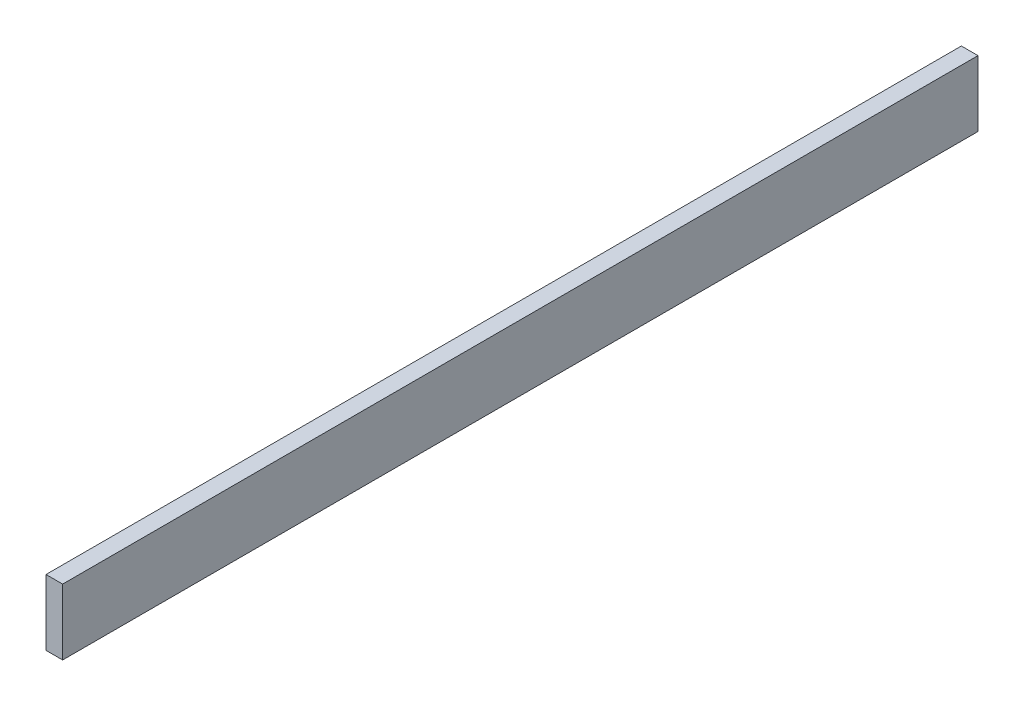
ISO-10303-21;
HEADER;
FILE_DESCRIPTION(('STEP AP214'),'2;1');
FILE_NAME('part.step','',(''),(''),'','','');
FILE_SCHEMA(('AUTOMOTIVE_DESIGN { 1 0 10303 214 1 1 1 1 }'));
ENDSEC;
DATA;
#1=APPLICATION_CONTEXT('core data for automotive mechanical design processes');
#2=APPLICATION_PROTOCOL_DEFINITION('international standard','automotive_design',2000,#1);
#3=PRODUCT_CONTEXT('',#1,'mechanical');
#4=PRODUCT('Part','Part','',(#3));
#5=PRODUCT_RELATED_PRODUCT_CATEGORY('part','',(#4));
#6=PRODUCT_DEFINITION_FORMATION('','',#4);
#7=PRODUCT_DEFINITION_CONTEXT('part definition',#1,'design');
#8=PRODUCT_DEFINITION('design','',#6,#7);
#9=PRODUCT_DEFINITION_SHAPE('','',#8);
#10=(LENGTH_UNIT() NAMED_UNIT(*) SI_UNIT(.MILLI.,.METRE.));
#11=(NAMED_UNIT(*) PLANE_ANGLE_UNIT() SI_UNIT($,.RADIAN.));
#12=(NAMED_UNIT(*) SI_UNIT($,.STERADIAN.) SOLID_ANGLE_UNIT());
#13=UNCERTAINTY_MEASURE_WITH_UNIT(LENGTH_MEASURE(1.E-05),#10,'distance_accuracy_value','');
#14=(GEOMETRIC_REPRESENTATION_CONTEXT(3) GLOBAL_UNCERTAINTY_ASSIGNED_CONTEXT((#13)) GLOBAL_UNIT_ASSIGNED_CONTEXT((#10,
#11,#12)) REPRESENTATION_CONTEXT('',''));
#15=CARTESIAN_POINT('',(0.,0.,0.));
#16=DIRECTION('',(0.,0.,1.));
#17=DIRECTION('',(1.,0.,0.));
#18=AXIS2_PLACEMENT_3D('',#15,#16,#17);
#19=CARTESIAN_POINT('',(-6.35,-22.606,558.8));
#20=DIRECTION('',(1.,0.,0.));
#21=DIRECTION('',(0.,0.,-1.));
#22=AXIS2_PLACEMENT_3D('',#19,#20,#21);
#23=PLANE('',#22);
#24=DIRECTION('',(0.,0.,1.));
#25=VECTOR('',#24,1.);
#26=CARTESIAN_POINT('',(-6.35,20.066,0.));
#27=LINE('',#26,#25);
#28=CARTESIAN_POINT('',(-6.35,20.066,0.));
#29=VERTEX_POINT('',#28);
#30=CARTESIAN_POINT('',(-6.35,20.066,558.8));
#31=VERTEX_POINT('',#30);
#32=EDGE_CURVE('E85',#29,#31,#27,.T.);
#33=ORIENTED_EDGE('',*,*,#32,.F.);
#34=DIRECTION('',(0.,-1.,0.));
#35=VECTOR('',#34,1.);
#36=CARTESIAN_POINT('',(-6.35,-22.606,0.));
#37=LINE('',#36,#35);
#38=CARTESIAN_POINT('',(-6.35,-20.066,0.));
#39=VERTEX_POINT('',#38);
#40=EDGE_CURVE('E40',#29,#39,#37,.T.);
#41=ORIENTED_EDGE('',*,*,#40,.T.);
#42=DIRECTION('',(0.,0.,1.));
#43=VECTOR('',#42,1.);
#44=CARTESIAN_POINT('',(-6.35,-20.066,0.));
#45=LINE('',#44,#43);
#46=CARTESIAN_POINT('',(-6.35,-20.066,558.8));
#47=VERTEX_POINT('',#46);
#48=EDGE_CURVE('E51',#39,#47,#45,.T.);
#49=ORIENTED_EDGE('',*,*,#48,.T.);
#50=DIRECTION('',(0.,-1.,0.));
#51=VECTOR('',#50,1.);
#52=CARTESIAN_POINT('',(-6.35,-22.606,558.8));
#53=LINE('',#52,#51);
#54=EDGE_CURVE('E12',#31,#47,#53,.T.);
#55=ORIENTED_EDGE('',*,*,#54,.F.);
#56=EDGE_LOOP('',(#33,#41,#49,#55));
#57=FACE_BOUND('',#56,.T.);
#58=ADVANCED_FACE('F37',(#57),#23,.F.);
#59=CARTESIAN_POINT('',(0.,0.,558.8));
#60=DIRECTION('',(0.,0.,-1.));
#61=DIRECTION('',(-1.,0.,0.));
#62=AXIS2_PLACEMENT_3D('',#59,#60,#61);
#63=PLANE('',#62);
#64=DIRECTION('',(-1.,0.,0.));
#65=VECTOR('',#64,1.);
#66=CARTESIAN_POINT('',(-6.35,20.066,558.8));
#67=LINE('',#66,#65);
#68=CARTESIAN_POINT('',(3.81,20.066,558.8));
#69=VERTEX_POINT('',#68);
#70=EDGE_CURVE('E83',#69,#31,#67,.T.);
#71=ORIENTED_EDGE('',*,*,#70,.T.);
#72=ORIENTED_EDGE('',*,*,#54,.T.);
#73=DIRECTION('',(1.,0.,0.));
#74=VECTOR('',#73,1.);
#75=CARTESIAN_POINT('',(-6.35,-20.066,558.8));
#76=LINE('',#75,#74);
#77=CARTESIAN_POINT('',(3.81,-20.066,558.8));
#78=VERTEX_POINT('',#77);
#79=EDGE_CURVE('E100',#47,#78,#76,.T.);
#80=ORIENTED_EDGE('',*,*,#79,.T.);
#81=DIRECTION('',(0.,1.,0.));
#82=VECTOR('',#81,1.);
#83=CARTESIAN_POINT('',(3.81,20.066,558.8));
#84=LINE('',#83,#82);
#85=EDGE_CURVE('E103',#78,#69,#84,.T.);
#86=ORIENTED_EDGE('',*,*,#85,.T.);
#87=EDGE_LOOP('',(#71,#72,#80,#86));
#88=FACE_BOUND('',#87,.T.);
#89=ADVANCED_FACE('F109',(#88),#63,.F.);
#90=CARTESIAN_POINT('',(0.,0.,0.));
#91=DIRECTION('',(0.,0.,-1.));
#92=DIRECTION('',(-1.,0.,0.));
#93=AXIS2_PLACEMENT_3D('',#90,#91,#92);
#94=PLANE('',#93);
#95=ORIENTED_EDGE('',*,*,#40,.F.);
#96=DIRECTION('',(-1.,0.,0.));
#97=VECTOR('',#96,1.);
#98=CARTESIAN_POINT('',(-6.35,20.066,0.));
#99=LINE('',#98,#97);
#100=CARTESIAN_POINT('',(3.81,20.066,0.));
#101=VERTEX_POINT('',#100);
#102=EDGE_CURVE('E80',#101,#29,#99,.T.);
#103=ORIENTED_EDGE('',*,*,#102,.F.);
#104=DIRECTION('',(0.,1.,0.));
#105=VECTOR('',#104,1.);
#106=CARTESIAN_POINT('',(3.81,20.066,0.));
#107=LINE('',#106,#105);
#108=CARTESIAN_POINT('',(3.81,-20.066,0.));
#109=VERTEX_POINT('',#108);
#110=EDGE_CURVE('E88',#109,#101,#107,.T.);
#111=ORIENTED_EDGE('',*,*,#110,.F.);
#112=DIRECTION('',(1.,0.,0.));
#113=VECTOR('',#112,1.);
#114=CARTESIAN_POINT('',(-6.35,-20.066,0.));
#115=LINE('',#114,#113);
#116=EDGE_CURVE('E91',#39,#109,#115,.T.);
#117=ORIENTED_EDGE('',*,*,#116,.F.);
#118=EDGE_LOOP('',(#95,#103,#111,#117));
#119=FACE_BOUND('',#118,.T.);
#120=ADVANCED_FACE('F94',(#119),#94,.T.);
#121=CARTESIAN_POINT('',(-6.35,20.066,0.));
#122=DIRECTION('',(0.,1.,0.));
#123=DIRECTION('',(0.,0.,1.));
#124=AXIS2_PLACEMENT_3D('',#121,#122,#123);
#125=PLANE('',#124);
#126=ORIENTED_EDGE('',*,*,#70,.F.);
#127=DIRECTION('',(0.,0.,1.));
#128=VECTOR('',#127,1.);
#129=CARTESIAN_POINT('',(3.81,20.066,0.));
#130=LINE('',#129,#128);
#131=EDGE_CURVE('E77',#101,#69,#130,.T.);
#132=ORIENTED_EDGE('',*,*,#131,.F.);
#133=ORIENTED_EDGE('',*,*,#102,.T.);
#134=ORIENTED_EDGE('',*,*,#32,.T.);
#135=EDGE_LOOP('',(#126,#132,#133,#134));
#136=FACE_BOUND('',#135,.T.);
#137=ADVANCED_FACE('F78',(#136),#125,.T.);
#138=CARTESIAN_POINT('',(3.81,20.066,0.));
#139=DIRECTION('',(1.,0.,0.));
#140=DIRECTION('',(0.,1.,0.));
#141=AXIS2_PLACEMENT_3D('',#138,#139,#140);
#142=PLANE('',#141);
#143=ORIENTED_EDGE('',*,*,#85,.F.);
#144=DIRECTION('',(0.,0.,1.));
#145=VECTOR('',#144,1.);
#146=CARTESIAN_POINT('',(3.81,-20.066,0.));
#147=LINE('',#146,#145);
#148=EDGE_CURVE('E59',#109,#78,#147,.T.);
#149=ORIENTED_EDGE('',*,*,#148,.F.);
#150=ORIENTED_EDGE('',*,*,#110,.T.);
#151=ORIENTED_EDGE('',*,*,#131,.T.);
#152=EDGE_LOOP('',(#143,#149,#150,#151));
#153=FACE_BOUND('',#152,.T.);
#154=ADVANCED_FACE('F89',(#153),#142,.T.);
#155=CARTESIAN_POINT('',(-6.35,-20.066,0.));
#156=DIRECTION('',(0.,-1.,0.));
#157=DIRECTION('',(0.,0.,-1.));
#158=AXIS2_PLACEMENT_3D('',#155,#156,#157);
#159=PLANE('',#158);
#160=ORIENTED_EDGE('',*,*,#79,.F.);
#161=ORIENTED_EDGE('',*,*,#48,.F.);
#162=ORIENTED_EDGE('',*,*,#116,.T.);
#163=ORIENTED_EDGE('',*,*,#148,.T.);
#164=EDGE_LOOP('',(#160,#161,#162,#163));
#165=FACE_BOUND('',#164,.T.);
#166=ADVANCED_FACE('F107',(#165),#159,.T.);
#167=CLOSED_SHELL('',(#58,#89,#120,#137,#154,#166));
#168=MANIFOLD_SOLID_BREP('B2',#167);
#169=ADVANCED_BREP_SHAPE_REPRESENTATION('',(#18,#168),#14);
#170=SHAPE_DEFINITION_REPRESENTATION(#9,#169);
ENDSEC;
END-ISO-10303-21;
